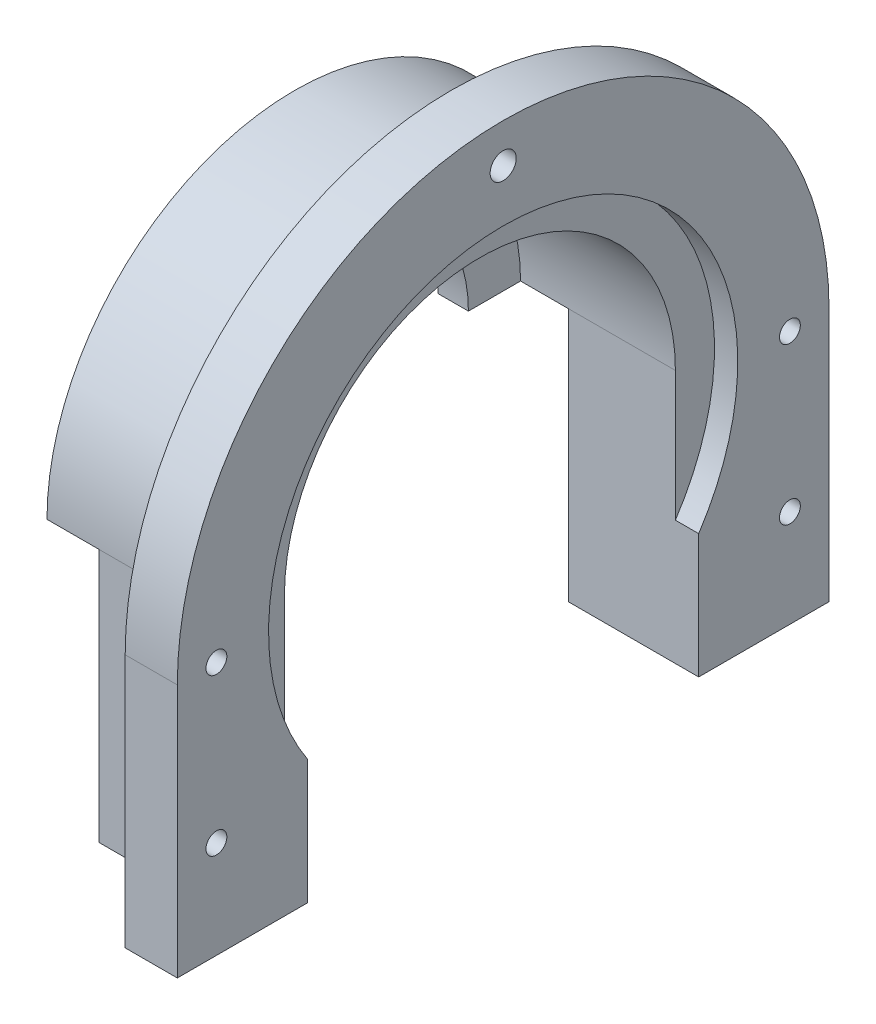
ISO-10303-21;
HEADER;
FILE_DESCRIPTION(('STEP AP214'),'2;1');
FILE_NAME('part.step','',(''),(''),'','','');
FILE_SCHEMA(('AUTOMOTIVE_DESIGN { 1 0 10303 214 1 1 1 1 }'));
ENDSEC;
DATA;
#1=APPLICATION_CONTEXT('core data for automotive mechanical design processes');
#2=APPLICATION_PROTOCOL_DEFINITION('international standard','automotive_design',2000,#1);
#3=PRODUCT_CONTEXT('',#1,'mechanical');
#4=PRODUCT('Part','Part','',(#3));
#5=PRODUCT_RELATED_PRODUCT_CATEGORY('part','',(#4));
#6=PRODUCT_DEFINITION_FORMATION('','',#4);
#7=PRODUCT_DEFINITION_CONTEXT('part definition',#1,'design');
#8=PRODUCT_DEFINITION('design','',#6,#7);
#9=PRODUCT_DEFINITION_SHAPE('','',#8);
#10=(LENGTH_UNIT() NAMED_UNIT(*) SI_UNIT(.MILLI.,.METRE.));
#11=(NAMED_UNIT(*) PLANE_ANGLE_UNIT() SI_UNIT($,.RADIAN.));
#12=(NAMED_UNIT(*) SI_UNIT($,.STERADIAN.) SOLID_ANGLE_UNIT());
#13=UNCERTAINTY_MEASURE_WITH_UNIT(LENGTH_MEASURE(1.E-05),#10,'distance_accuracy_value','');
#14=(GEOMETRIC_REPRESENTATION_CONTEXT(3) GLOBAL_UNCERTAINTY_ASSIGNED_CONTEXT((#13)) GLOBAL_UNIT_ASSIGNED_CONTEXT((#10,
#11,#12)) REPRESENTATION_CONTEXT('',''));
#15=CARTESIAN_POINT('',(0.,0.,0.));
#16=DIRECTION('',(0.,0.,1.));
#17=DIRECTION('',(1.,0.,0.));
#18=AXIS2_PLACEMENT_3D('',#15,#16,#17);
#19=CARTESIAN_POINT('',(30.,0.,0.));
#20=DIRECTION('',(-1.,0.,0.));
#21=DIRECTION('',(0.,0.,1.));
#22=AXIS2_PLACEMENT_3D('',#19,#20,#21);
#23=CYLINDRICAL_SURFACE('',#22,37.5);
#24=CARTESIAN_POINT('',(35.5344886511846,0.,0.));
#25=DIRECTION('',(1.,0.,0.));
#26=DIRECTION('',(0.,1.,0.));
#27=AXIS2_PLACEMENT_3D('',#24,#25,#26);
#28=CIRCLE('',#27,37.5);
#29=CARTESIAN_POINT('',(35.5344886511846,0.,37.5));
#30=VERTEX_POINT('',#29);
#31=CARTESIAN_POINT('',(35.5344886511846,0.,-37.5));
#32=VERTEX_POINT('',#31);
#33=EDGE_CURVE('E170',#30,#32,#28,.F.);
#34=ORIENTED_EDGE('',*,*,#33,.F.);
#35=DIRECTION('',(-1.,0.,0.));
#36=VECTOR('',#35,1.);
#37=CARTESIAN_POINT('',(30.,0.,37.5));
#38=LINE('',#37,#36);
#39=CARTESIAN_POINT('',(10.,0.,37.5));
#40=VERTEX_POINT('',#39);
#41=EDGE_CURVE('E181',#30,#40,#38,.T.);
#42=ORIENTED_EDGE('',*,*,#41,.T.);
#43=DIRECTION('',(1.,0.,0.));
#44=VECTOR('',#43,1.);
#45=CARTESIAN_POINT('',(-78.0180605050575,0.,37.5));
#46=LINE('',#45,#44);
#47=CARTESIAN_POINT('',(5.83448865118458,0.,37.5));
#48=VERTEX_POINT('',#47);
#49=EDGE_CURVE('E182',#48,#40,#46,.T.);
#50=ORIENTED_EDGE('',*,*,#49,.F.);
#51=CARTESIAN_POINT('',(5.83448865118458,0.,0.));
#52=DIRECTION('',(1.,0.,0.));
#53=DIRECTION('',(0.,1.,0.));
#54=AXIS2_PLACEMENT_3D('',#51,#52,#53);
#55=CIRCLE('',#54,37.5);
#56=CARTESIAN_POINT('',(5.83448865118458,0.,-37.5));
#57=VERTEX_POINT('',#56);
#58=EDGE_CURVE('E193',#48,#57,#55,.F.);
#59=ORIENTED_EDGE('',*,*,#58,.T.);
#60=DIRECTION('',(-1.,0.,0.));
#61=VECTOR('',#60,1.);
#62=CARTESIAN_POINT('',(30.,0.,-37.5));
#63=LINE('',#62,#61);
#64=CARTESIAN_POINT('',(15.,0.,-37.5));
#65=VERTEX_POINT('',#64);
#66=EDGE_CURVE('E309',#65,#57,#63,.T.);
#67=ORIENTED_EDGE('',*,*,#66,.F.);
#68=EDGE_CURVE('E310',#32,#65,#63,.T.);
#69=ORIENTED_EDGE('',*,*,#68,.F.);
#70=EDGE_LOOP('',(#34,#42,#50,#59,#67,#69));
#71=FACE_BOUND('',#70,.T.);
#72=ADVANCED_FACE('F36',(#71),#23,.F.);
#73=CARTESIAN_POINT('',(30.,-81.0478555971922,37.5));
#74=DIRECTION('',(0.,0.,1.));
#75=DIRECTION('',(0.,-1.,0.));
#76=AXIS2_PLACEMENT_3D('',#73,#74,#75);
#77=PLANE('',#76);
#78=DIRECTION('',(1.,0.,0.));
#79=VECTOR('',#78,1.);
#80=CARTESIAN_POINT('',(-91.7447319623941,-24.8746859276655,37.5));
#81=LINE('',#80,#79);
#82=CARTESIAN_POINT('',(40.,-24.8746859276655,37.5));
#83=VERTEX_POINT('',#82);
#84=CARTESIAN_POINT('',(35.5344886511846,-24.8746859276655,37.5));
#85=VERTEX_POINT('',#84);
#86=EDGE_CURVE('E161',#83,#85,#81,.F.);
#87=ORIENTED_EDGE('',*,*,#86,.F.);
#88=DIRECTION('',(0.,1.,0.));
#89=VECTOR('',#88,1.);
#90=CARTESIAN_POINT('',(40.,-48.6871758221943,37.5));
#91=LINE('',#90,#89);
#92=CARTESIAN_POINT('',(40.,-48.6871758221943,37.5));
#93=VERTEX_POINT('',#92);
#94=EDGE_CURVE('E239',#93,#83,#91,.T.);
#95=ORIENTED_EDGE('',*,*,#94,.F.);
#96=DIRECTION('',(1.,0.,0.));
#97=VECTOR('',#96,1.);
#98=CARTESIAN_POINT('',(30.,-48.6871758221943,37.5));
#99=LINE('',#98,#97);
#100=CARTESIAN_POINT('',(10.,-48.6871758221943,37.5));
#101=VERTEX_POINT('',#100);
#102=EDGE_CURVE('E302',#101,#93,#99,.T.);
#103=ORIENTED_EDGE('',*,*,#102,.F.);
#104=DIRECTION('',(0.,1.,0.));
#105=VECTOR('',#104,1.);
#106=CARTESIAN_POINT('',(10.,-81.0478555971922,37.5));
#107=LINE('',#106,#105);
#108=EDGE_CURVE('E293',#101,#40,#107,.T.);
#109=ORIENTED_EDGE('',*,*,#108,.T.);
#110=ORIENTED_EDGE('',*,*,#41,.F.);
#111=DIRECTION('',(0.,1.,0.));
#112=VECTOR('',#111,1.);
#113=CARTESIAN_POINT('',(35.5344886511846,-81.0478555971922,37.5));
#114=LINE('',#113,#112);
#115=EDGE_CURVE('E174',#85,#30,#114,.T.);
#116=ORIENTED_EDGE('',*,*,#115,.F.);
#117=EDGE_LOOP('',(#87,#95,#103,#109,#110,#116));
#118=FACE_BOUND('',#117,.T.);
#119=ADVANCED_FACE('F179',(#118),#77,.F.);
#120=CARTESIAN_POINT('',(30.,-81.0478555971922,-37.5));
#121=DIRECTION('',(0.,0.,-1.));
#122=DIRECTION('',(0.,1.,0.));
#123=AXIS2_PLACEMENT_3D('',#120,#121,#122);
#124=PLANE('',#123);
#125=DIRECTION('',(1.,0.,0.));
#126=VECTOR('',#125,1.);
#127=CARTESIAN_POINT('',(-91.7447319623941,-24.8746859276656,-37.5));
#128=LINE('',#127,#126);
#129=CARTESIAN_POINT('',(35.5344886511846,-24.8746859276656,-37.5));
#130=VERTEX_POINT('',#129);
#131=CARTESIAN_POINT('',(40.,-24.8746859276656,-37.5));
#132=VERTEX_POINT('',#131);
#133=EDGE_CURVE('E51',#130,#132,#128,.T.);
#134=ORIENTED_EDGE('',*,*,#133,.F.);
#135=DIRECTION('',(0.,-1.,0.));
#136=VECTOR('',#135,1.);
#137=CARTESIAN_POINT('',(35.5344886511846,-81.0478555971922,-37.5));
#138=LINE('',#137,#136);
#139=EDGE_CURVE('E12',#32,#130,#138,.T.);
#140=ORIENTED_EDGE('',*,*,#139,.F.);
#141=ORIENTED_EDGE('',*,*,#68,.T.);
#142=DIRECTION('',(0.,1.,0.));
#143=VECTOR('',#142,1.);
#144=CARTESIAN_POINT('',(15.,-81.0478555971922,-37.5));
#145=LINE('',#144,#143);
#146=CARTESIAN_POINT('',(15.,-48.6871758221943,-37.5));
#147=VERTEX_POINT('',#146);
#148=EDGE_CURVE('E274',#147,#65,#145,.T.);
#149=ORIENTED_EDGE('',*,*,#148,.F.);
#150=DIRECTION('',(-1.,0.,0.));
#151=VECTOR('',#150,1.);
#152=CARTESIAN_POINT('',(30.,-48.6871758221943,-37.5));
#153=LINE('',#152,#151);
#154=CARTESIAN_POINT('',(40.,-48.6871758221943,-37.5));
#155=VERTEX_POINT('',#154);
#156=EDGE_CURVE('E279',#155,#147,#153,.T.);
#157=ORIENTED_EDGE('',*,*,#156,.F.);
#158=DIRECTION('',(0.,-1.,0.));
#159=VECTOR('',#158,1.);
#160=CARTESIAN_POINT('',(40.,-48.6871758221943,-37.5));
#161=LINE('',#160,#159);
#162=EDGE_CURVE('E241',#132,#155,#161,.T.);
#163=ORIENTED_EDGE('',*,*,#162,.F.);
#164=EDGE_LOOP('',(#134,#140,#141,#149,#157,#163));
#165=FACE_BOUND('',#164,.T.);
#166=ADVANCED_FACE('F343',(#165),#124,.F.);
#167=CARTESIAN_POINT('',(10.,0.,0.));
#168=DIRECTION('',(-1.,0.,0.));
#169=DIRECTION('',(0.,0.,1.));
#170=AXIS2_PLACEMENT_3D('',#167,#168,#169);
#171=CYLINDRICAL_SURFACE('',#170,27.5);
#172=CARTESIAN_POINT('',(5.83448865118458,0.,0.));
#173=DIRECTION('',(1.,0.,0.));
#174=DIRECTION('',(0.,1.,0.));
#175=AXIS2_PLACEMENT_3D('',#172,#173,#174);
#176=CIRCLE('',#175,27.5);
#177=CARTESIAN_POINT('',(5.83448865118458,0.,-27.5));
#178=VERTEX_POINT('',#177);
#179=CARTESIAN_POINT('',(5.83448865118458,0.,27.5));
#180=VERTEX_POINT('',#179);
#181=EDGE_CURVE('E185',#178,#180,#176,.T.);
#182=ORIENTED_EDGE('',*,*,#181,.T.);
#183=DIRECTION('',(-1.,0.,0.));
#184=VECTOR('',#183,1.);
#185=CARTESIAN_POINT('',(10.,0.,27.5));
#186=LINE('',#185,#184);
#187=CARTESIAN_POINT('',(0.,0.,27.5));
#188=VERTEX_POINT('',#187);
#189=EDGE_CURVE('E59',#180,#188,#186,.T.);
#190=ORIENTED_EDGE('',*,*,#189,.T.);
#191=CARTESIAN_POINT('',(0.,0.,0.));
#192=DIRECTION('',(-1.,0.,0.));
#193=DIRECTION('',(0.,0.,-1.));
#194=AXIS2_PLACEMENT_3D('',#191,#192,#193);
#195=CIRCLE('',#194,27.5);
#196=CARTESIAN_POINT('',(0.,0.,-27.5));
#197=VERTEX_POINT('',#196);
#198=EDGE_CURVE('E313',#188,#197,#195,.T.);
#199=ORIENTED_EDGE('',*,*,#198,.T.);
#200=DIRECTION('',(-1.,0.,0.));
#201=VECTOR('',#200,1.);
#202=CARTESIAN_POINT('',(10.,0.,-27.5));
#203=LINE('',#202,#201);
#204=EDGE_CURVE('E44',#178,#197,#203,.T.);
#205=ORIENTED_EDGE('',*,*,#204,.F.);
#206=EDGE_LOOP('',(#182,#190,#199,#205));
#207=FACE_BOUND('',#206,.T.);
#208=ADVANCED_FACE('F38',(#207),#171,.F.);
#209=CARTESIAN_POINT('',(10.,0.,-27.5));
#210=DIRECTION('',(0.,1.,0.));
#211=DIRECTION('',(0.,0.,1.));
#212=AXIS2_PLACEMENT_3D('',#209,#210,#211);
#213=PLANE('',#212);
#214=ORIENTED_EDGE('',*,*,#66,.T.);
#215=DIRECTION('',(0.,0.,1.));
#216=VECTOR('',#215,1.);
#217=CARTESIAN_POINT('',(5.83448865118458,0.,-27.5));
#218=LINE('',#217,#216);
#219=EDGE_CURVE('E190',#57,#178,#218,.T.);
#220=ORIENTED_EDGE('',*,*,#219,.T.);
#221=ORIENTED_EDGE('',*,*,#204,.T.);
#222=DIRECTION('',(0.,0.,-1.));
#223=VECTOR('',#222,1.);
#224=CARTESIAN_POINT('',(0.,0.,-27.5));
#225=LINE('',#224,#223);
#226=CARTESIAN_POINT('',(0.,0.,-47.5));
#227=VERTEX_POINT('',#226);
#228=EDGE_CURVE('E315',#197,#227,#225,.T.);
#229=ORIENTED_EDGE('',*,*,#228,.T.);
#230=DIRECTION('',(-1.,0.,0.));
#231=VECTOR('',#230,1.);
#232=CARTESIAN_POINT('',(10.,0.,-47.5));
#233=LINE('',#232,#231);
#234=CARTESIAN_POINT('',(15.,0.,-47.5));
#235=VERTEX_POINT('',#234);
#236=EDGE_CURVE('E328',#235,#227,#233,.T.);
#237=ORIENTED_EDGE('',*,*,#236,.F.);
#238=DIRECTION('',(0.,0.,-1.));
#239=VECTOR('',#238,1.);
#240=CARTESIAN_POINT('',(15.,0.,-37.5));
#241=LINE('',#240,#239);
#242=EDGE_CURVE('E270',#65,#235,#241,.T.);
#243=ORIENTED_EDGE('',*,*,#242,.F.);
#244=EDGE_LOOP('',(#214,#220,#221,#229,#237,#243));
#245=FACE_BOUND('',#244,.T.);
#246=ADVANCED_FACE('F334',(#245),#213,.F.);
#247=CARTESIAN_POINT('',(10.,0.,47.5));
#248=DIRECTION('',(0.,1.,0.));
#249=DIRECTION('',(0.,0.,1.));
#250=AXIS2_PLACEMENT_3D('',#247,#248,#249);
#251=PLANE('',#250);
#252=DIRECTION('',(0.,0.,1.));
#253=VECTOR('',#252,1.);
#254=CARTESIAN_POINT('',(5.83448865118458,0.,37.5));
#255=LINE('',#254,#253);
#256=EDGE_CURVE('E195',#180,#48,#255,.T.);
#257=ORIENTED_EDGE('',*,*,#256,.T.);
#258=ORIENTED_EDGE('',*,*,#49,.T.);
#259=DIRECTION('',(0.,0.,-1.));
#260=VECTOR('',#259,1.);
#261=CARTESIAN_POINT('',(10.,0.,47.5));
#262=LINE('',#261,#260);
#263=CARTESIAN_POINT('',(10.,0.,47.5));
#264=VERTEX_POINT('',#263);
#265=EDGE_CURVE('E290',#264,#40,#262,.T.);
#266=ORIENTED_EDGE('',*,*,#265,.F.);
#267=DIRECTION('',(-1.,0.,0.));
#268=VECTOR('',#267,1.);
#269=CARTESIAN_POINT('',(10.,0.,47.5));
#270=LINE('',#269,#268);
#271=CARTESIAN_POINT('',(0.,0.,47.5));
#272=VERTEX_POINT('',#271);
#273=EDGE_CURVE('E324',#264,#272,#270,.T.);
#274=ORIENTED_EDGE('',*,*,#273,.T.);
#275=DIRECTION('',(0.,0.,-1.));
#276=VECTOR('',#275,1.);
#277=CARTESIAN_POINT('',(0.,0.,47.5));
#278=LINE('',#277,#276);
#279=EDGE_CURVE('E321',#272,#188,#278,.T.);
#280=ORIENTED_EDGE('',*,*,#279,.T.);
#281=ORIENTED_EDGE('',*,*,#189,.F.);
#282=EDGE_LOOP('',(#257,#258,#266,#274,#280,#281));
#283=FACE_BOUND('',#282,.T.);
#284=ADVANCED_FACE('F348',(#283),#251,.F.);
#285=CARTESIAN_POINT('',(10.,0.,0.));
#286=DIRECTION('',(-1.,0.,0.));
#287=DIRECTION('',(0.,0.,1.));
#288=AXIS2_PLACEMENT_3D('',#285,#286,#287);
#289=CYLINDRICAL_SURFACE('',#288,47.5);
#290=CARTESIAN_POINT('',(0.,0.,0.));
#291=DIRECTION('',(1.,0.,0.));
#292=DIRECTION('',(0.,0.,-1.));
#293=AXIS2_PLACEMENT_3D('',#290,#291,#292);
#294=CIRCLE('',#293,47.5);
#295=EDGE_CURVE('E318',#227,#272,#294,.T.);
#296=ORIENTED_EDGE('',*,*,#295,.T.);
#297=ORIENTED_EDGE('',*,*,#273,.F.);
#298=CARTESIAN_POINT('',(30.,0.,47.5));
#299=VERTEX_POINT('',#298);
#300=EDGE_CURVE('E325',#299,#264,#270,.T.);
#301=ORIENTED_EDGE('',*,*,#300,.F.);
#302=CARTESIAN_POINT('',(30.,0.,0.));
#303=DIRECTION('',(1.,0.,0.));
#304=DIRECTION('',(0.,0.,-1.));
#305=AXIS2_PLACEMENT_3D('',#302,#303,#304);
#306=CIRCLE('',#305,47.5);
#307=CARTESIAN_POINT('',(30.,0.,-47.5));
#308=VERTEX_POINT('',#307);
#309=EDGE_CURVE('E298',#308,#299,#306,.T.);
#310=ORIENTED_EDGE('',*,*,#309,.F.);
#311=EDGE_CURVE('E329',#308,#235,#233,.T.);
#312=ORIENTED_EDGE('',*,*,#311,.T.);
#313=ORIENTED_EDGE('',*,*,#236,.T.);
#314=EDGE_LOOP('',(#296,#297,#301,#310,#312,#313));
#315=FACE_BOUND('',#314,.T.);
#316=ADVANCED_FACE('F365',(#315),#289,.T.);
#317=CARTESIAN_POINT('',(0.,0.,0.));
#318=DIRECTION('',(1.,0.,0.));
#319=DIRECTION('',(0.,0.,-1.));
#320=AXIS2_PLACEMENT_3D('',#317,#318,#319);
#321=PLANE('',#320);
#322=ORIENTED_EDGE('',*,*,#198,.F.);
#323=ORIENTED_EDGE('',*,*,#279,.F.);
#324=ORIENTED_EDGE('',*,*,#295,.F.);
#325=ORIENTED_EDGE('',*,*,#228,.F.);
#326=EDGE_LOOP('',(#322,#323,#324,#325));
#327=FACE_BOUND('',#326,.T.);
#328=ADVANCED_FACE('F340',(#327),#321,.F.);
#329=CARTESIAN_POINT('',(30.,-81.0478555971922,47.5));
#330=DIRECTION('',(0.,0.,-1.));
#331=DIRECTION('',(0.,1.,0.));
#332=AXIS2_PLACEMENT_3D('',#329,#330,#331);
#333=PLANE('',#332);
#334=DIRECTION('',(-1.,0.,0.));
#335=VECTOR('',#334,1.);
#336=CARTESIAN_POINT('',(30.,-48.6871758221943,47.5));
#337=LINE('',#336,#335);
#338=CARTESIAN_POINT('',(30.,-48.6871758221943,47.5));
#339=VERTEX_POINT('',#338);
#340=CARTESIAN_POINT('',(10.,-48.6871758221943,47.5));
#341=VERTEX_POINT('',#340);
#342=EDGE_CURVE('E299',#339,#341,#337,.T.);
#343=ORIENTED_EDGE('',*,*,#342,.F.);
#344=DIRECTION('',(0.,1.,0.));
#345=VECTOR('',#344,1.);
#346=CARTESIAN_POINT('',(30.,-81.0478555971922,47.5));
#347=LINE('',#346,#345);
#348=EDGE_CURVE('E278',#339,#299,#347,.T.);
#349=ORIENTED_EDGE('',*,*,#348,.T.);
#350=ORIENTED_EDGE('',*,*,#300,.T.);
#351=DIRECTION('',(0.,1.,0.));
#352=VECTOR('',#351,1.);
#353=CARTESIAN_POINT('',(10.,-81.0478555971922,47.5));
#354=LINE('',#353,#352);
#355=EDGE_CURVE('E294',#341,#264,#354,.T.);
#356=ORIENTED_EDGE('',*,*,#355,.F.);
#357=EDGE_LOOP('',(#343,#349,#350,#356));
#358=FACE_BOUND('',#357,.T.);
#359=ADVANCED_FACE('F364',(#358),#333,.F.);
#360=CARTESIAN_POINT('',(10.,-81.0478555971922,47.5));
#361=DIRECTION('',(1.,0.,0.));
#362=DIRECTION('',(0.,0.,-1.));
#363=AXIS2_PLACEMENT_3D('',#360,#361,#362);
#364=PLANE('',#363);
#365=DIRECTION('',(0.,0.,-1.));
#366=VECTOR('',#365,1.);
#367=CARTESIAN_POINT('',(10.,-48.6871758221943,47.5));
#368=LINE('',#367,#366);
#369=EDGE_CURVE('E295',#341,#101,#368,.T.);
#370=ORIENTED_EDGE('',*,*,#369,.F.);
#371=ORIENTED_EDGE('',*,*,#355,.T.);
#372=ORIENTED_EDGE('',*,*,#265,.T.);
#373=ORIENTED_EDGE('',*,*,#108,.F.);
#374=EDGE_LOOP('',(#370,#371,#372,#373));
#375=FACE_BOUND('',#374,.T.);
#376=ADVANCED_FACE('F378',(#375),#364,.F.);
#377=CARTESIAN_POINT('',(0.,-48.6871758221943,0.));
#378=DIRECTION('',(0.,-1.,0.));
#379=DIRECTION('',(0.,0.,-1.));
#380=AXIS2_PLACEMENT_3D('',#377,#378,#379);
#381=PLANE('',#380);
#382=ORIENTED_EDGE('',*,*,#102,.T.);
#383=DIRECTION('',(0.,0.,-1.));
#384=VECTOR('',#383,1.);
#385=CARTESIAN_POINT('',(40.,-48.6871758221943,37.5));
#386=LINE('',#385,#384);
#387=CARTESIAN_POINT('',(40.,-48.6871758221943,62.5));
#388=VERTEX_POINT('',#387);
#389=EDGE_CURVE('E236',#388,#93,#386,.T.);
#390=ORIENTED_EDGE('',*,*,#389,.F.);
#391=DIRECTION('',(-1.,0.,0.));
#392=VECTOR('',#391,1.);
#393=CARTESIAN_POINT('',(40.,-48.6871758221943,62.5));
#394=LINE('',#393,#392);
#395=CARTESIAN_POINT('',(30.,-48.6871758221943,62.5));
#396=VERTEX_POINT('',#395);
#397=EDGE_CURVE('E263',#388,#396,#394,.T.);
#398=ORIENTED_EDGE('',*,*,#397,.T.);
#399=DIRECTION('',(0.,0.,-1.));
#400=VECTOR('',#399,1.);
#401=CARTESIAN_POINT('',(30.,-48.6871758221943,37.5));
#402=LINE('',#401,#400);
#403=EDGE_CURVE('E252',#396,#339,#402,.T.);
#404=ORIENTED_EDGE('',*,*,#403,.T.);
#405=ORIENTED_EDGE('',*,*,#342,.T.);
#406=ORIENTED_EDGE('',*,*,#369,.T.);
#407=EDGE_LOOP('',(#382,#390,#398,#404,#405,#406));
#408=FACE_BOUND('',#407,.T.);
#409=ADVANCED_FACE('F360',(#408),#381,.T.);
#410=CARTESIAN_POINT('',(15.,-81.0478555971922,-37.5));
#411=DIRECTION('',(1.,0.,0.));
#412=DIRECTION('',(0.,0.,-1.));
#413=AXIS2_PLACEMENT_3D('',#410,#411,#412);
#414=PLANE('',#413);
#415=DIRECTION('',(0.,0.,-1.));
#416=VECTOR('',#415,1.);
#417=CARTESIAN_POINT('',(15.,-48.6871758221943,-37.5));
#418=LINE('',#417,#416);
#419=CARTESIAN_POINT('',(15.,-48.6871758221943,-47.5));
#420=VERTEX_POINT('',#419);
#421=EDGE_CURVE('E275',#147,#420,#418,.T.);
#422=ORIENTED_EDGE('',*,*,#421,.F.);
#423=ORIENTED_EDGE('',*,*,#148,.T.);
#424=ORIENTED_EDGE('',*,*,#242,.T.);
#425=DIRECTION('',(0.,1.,0.));
#426=VECTOR('',#425,1.);
#427=CARTESIAN_POINT('',(15.,-81.0478555971922,-47.5));
#428=LINE('',#427,#426);
#429=EDGE_CURVE('E273',#420,#235,#428,.T.);
#430=ORIENTED_EDGE('',*,*,#429,.F.);
#431=EDGE_LOOP('',(#422,#423,#424,#430));
#432=FACE_BOUND('',#431,.T.);
#433=ADVANCED_FACE('F400',(#432),#414,.F.);
#434=CARTESIAN_POINT('',(30.,-81.0478555971922,-47.5));
#435=DIRECTION('',(0.,0.,1.));
#436=DIRECTION('',(0.,-1.,0.));
#437=AXIS2_PLACEMENT_3D('',#434,#435,#436);
#438=PLANE('',#437);
#439=DIRECTION('',(1.,0.,0.));
#440=VECTOR('',#439,1.);
#441=CARTESIAN_POINT('',(30.,-48.6871758221943,-47.5));
#442=LINE('',#441,#440);
#443=CARTESIAN_POINT('',(30.,-48.6871758221943,-47.5));
#444=VERTEX_POINT('',#443);
#445=EDGE_CURVE('E282',#420,#444,#442,.T.);
#446=ORIENTED_EDGE('',*,*,#445,.F.);
#447=ORIENTED_EDGE('',*,*,#429,.T.);
#448=ORIENTED_EDGE('',*,*,#311,.F.);
#449=DIRECTION('',(0.,1.,0.));
#450=VECTOR('',#449,1.);
#451=CARTESIAN_POINT('',(30.,-81.0478555971922,-47.5));
#452=LINE('',#451,#450);
#453=EDGE_CURVE('E269',#444,#308,#452,.T.);
#454=ORIENTED_EDGE('',*,*,#453,.F.);
#455=EDGE_LOOP('',(#446,#447,#448,#454));
#456=FACE_BOUND('',#455,.T.);
#457=ADVANCED_FACE('F392',(#456),#438,.F.);
#458=CARTESIAN_POINT('',(0.,-48.6871758221943,0.));
#459=DIRECTION('',(0.,-1.,0.));
#460=DIRECTION('',(0.,0.,-1.));
#461=AXIS2_PLACEMENT_3D('',#458,#459,#460);
#462=PLANE('',#461);
#463=ORIENTED_EDGE('',*,*,#445,.T.);
#464=DIRECTION('',(0.,0.,-1.));
#465=VECTOR('',#464,1.);
#466=CARTESIAN_POINT('',(30.,-48.6871758221943,-62.5));
#467=LINE('',#466,#465);
#468=CARTESIAN_POINT('',(30.,-48.6871758221943,-62.5));
#469=VERTEX_POINT('',#468);
#470=EDGE_CURVE('E255',#444,#469,#467,.T.);
#471=ORIENTED_EDGE('',*,*,#470,.T.);
#472=DIRECTION('',(-1.,0.,0.));
#473=VECTOR('',#472,1.);
#474=CARTESIAN_POINT('',(40.,-48.6871758221943,-62.5));
#475=LINE('',#474,#473);
#476=CARTESIAN_POINT('',(40.,-48.6871758221943,-62.5));
#477=VERTEX_POINT('',#476);
#478=EDGE_CURVE('E260',#477,#469,#475,.T.);
#479=ORIENTED_EDGE('',*,*,#478,.F.);
#480=DIRECTION('',(0.,0.,-1.));
#481=VECTOR('',#480,1.);
#482=CARTESIAN_POINT('',(40.,-48.6871758221943,-62.5));
#483=LINE('',#482,#481);
#484=EDGE_CURVE('E243',#155,#477,#483,.T.);
#485=ORIENTED_EDGE('',*,*,#484,.F.);
#486=ORIENTED_EDGE('',*,*,#156,.T.);
#487=ORIENTED_EDGE('',*,*,#421,.T.);
#488=EDGE_LOOP('',(#463,#471,#479,#485,#486,#487));
#489=FACE_BOUND('',#488,.T.);
#490=ADVANCED_FACE('F394',(#489),#462,.T.);
#491=CARTESIAN_POINT('',(40.,0.,0.));
#492=DIRECTION('',(1.,0.,0.));
#493=DIRECTION('',(0.,0.,-1.));
#494=AXIS2_PLACEMENT_3D('',#491,#492,#493);
#495=PLANE('',#494);
#496=CARTESIAN_POINT('',(40.,-30.,-55.));
#497=DIRECTION('',(1.,0.,0.));
#498=DIRECTION('',(0.,0.,1.));
#499=AXIS2_PLACEMENT_3D('',#496,#497,#498);
#500=CIRCLE('',#499,2.);
#501=CARTESIAN_POINT('',(40.,-30.,-53.));
#502=VERTEX_POINT('',#501);
#503=EDGE_CURVE('E206',#502,#502,#500,.T.);
#504=ORIENTED_EDGE('',*,*,#503,.F.);
#505=EDGE_LOOP('',(#504));
#506=FACE_BOUND('',#505,.T.);
#507=CARTESIAN_POINT('',(40.,0.,55.));
#508=DIRECTION('',(1.,0.,0.));
#509=DIRECTION('',(0.,0.,-1.));
#510=AXIS2_PLACEMENT_3D('',#507,#508,#509);
#511=CIRCLE('',#510,2.);
#512=CARTESIAN_POINT('',(40.,0.,53.));
#513=VERTEX_POINT('',#512);
#514=EDGE_CURVE('E218',#513,#513,#511,.T.);
#515=ORIENTED_EDGE('',*,*,#514,.F.);
#516=EDGE_LOOP('',(#515));
#517=FACE_BOUND('',#516,.T.);
#518=ORIENTED_EDGE('',*,*,#94,.T.);
#519=CARTESIAN_POINT('',(40.,0.,0.));
#520=DIRECTION('',(-1.,0.,0.));
#521=DIRECTION('',(0.,-1.,0.));
#522=AXIS2_PLACEMENT_3D('',#519,#520,#521);
#523=CIRCLE('',#522,45.);
#524=EDGE_CURVE('E165',#83,#132,#523,.T.);
#525=ORIENTED_EDGE('',*,*,#524,.T.);
#526=ORIENTED_EDGE('',*,*,#162,.T.);
#527=ORIENTED_EDGE('',*,*,#484,.T.);
#528=DIRECTION('',(0.,1.,0.));
#529=VECTOR('',#528,1.);
#530=CARTESIAN_POINT('',(40.,-48.6871758221943,-62.5));
#531=LINE('',#530,#529);
#532=CARTESIAN_POINT('',(40.,0.,-62.5));
#533=VERTEX_POINT('',#532);
#534=EDGE_CURVE('E245',#477,#533,#531,.T.);
#535=ORIENTED_EDGE('',*,*,#534,.T.);
#536=CARTESIAN_POINT('',(40.,0.,0.));
#537=DIRECTION('',(1.,0.,0.));
#538=DIRECTION('',(0.,0.,-1.));
#539=AXIS2_PLACEMENT_3D('',#536,#537,#538);
#540=CIRCLE('',#539,62.5);
#541=CARTESIAN_POINT('',(40.,0.,62.5));
#542=VERTEX_POINT('',#541);
#543=EDGE_CURVE('E230',#533,#542,#540,.T.);
#544=ORIENTED_EDGE('',*,*,#543,.T.);
#545=DIRECTION('',(0.,-1.,0.));
#546=VECTOR('',#545,1.);
#547=CARTESIAN_POINT('',(40.,0.,62.5));
#548=LINE('',#547,#546);
#549=EDGE_CURVE('E233',#542,#388,#548,.T.);
#550=ORIENTED_EDGE('',*,*,#549,.T.);
#551=ORIENTED_EDGE('',*,*,#389,.T.);
#552=EDGE_LOOP('',(#518,#525,#526,#527,#535,#544,#550,#551));
#553=FACE_BOUND('',#552,.T.);
#554=CARTESIAN_POINT('',(40.,-30.,55.));
#555=DIRECTION('',(1.,0.,0.));
#556=DIRECTION('',(0.,0.,-1.));
#557=AXIS2_PLACEMENT_3D('',#554,#555,#556);
#558=CIRCLE('',#557,2.);
#559=CARTESIAN_POINT('',(40.,-30.,53.));
#560=VERTEX_POINT('',#559);
#561=EDGE_CURVE('E224',#560,#560,#558,.T.);
#562=ORIENTED_EDGE('',*,*,#561,.F.);
#563=EDGE_LOOP('',(#562));
#564=FACE_BOUND('',#563,.T.);
#565=CARTESIAN_POINT('',(40.,55.,0.));
#566=DIRECTION('',(1.,0.,0.));
#567=DIRECTION('',(0.,0.,-1.));
#568=AXIS2_PLACEMENT_3D('',#565,#566,#567);
#569=CIRCLE('',#568,2.5);
#570=CARTESIAN_POINT('',(40.,55.,-2.5));
#571=VERTEX_POINT('',#570);
#572=EDGE_CURVE('E212',#571,#571,#569,.T.);
#573=ORIENTED_EDGE('',*,*,#572,.F.);
#574=EDGE_LOOP('',(#573));
#575=FACE_BOUND('',#574,.T.);
#576=CARTESIAN_POINT('',(40.,0.,-55.));
#577=DIRECTION('',(1.,0.,0.));
#578=DIRECTION('',(0.,0.,1.));
#579=AXIS2_PLACEMENT_3D('',#576,#577,#578);
#580=CIRCLE('',#579,2.);
#581=CARTESIAN_POINT('',(40.,0.,-53.));
#582=VERTEX_POINT('',#581);
#583=EDGE_CURVE('E200',#582,#582,#580,.T.);
#584=ORIENTED_EDGE('',*,*,#583,.F.);
#585=EDGE_LOOP('',(#584));
#586=FACE_BOUND('',#585,.T.);
#587=ADVANCED_FACE('F436',(#506,#517,#553,#564,#575,#586),#495,.T.);
#588=CARTESIAN_POINT('',(30.,0.,0.));
#589=DIRECTION('',(1.,0.,0.));
#590=DIRECTION('',(0.,0.,-1.));
#591=AXIS2_PLACEMENT_3D('',#588,#589,#590);
#592=PLANE('',#591);
#593=ORIENTED_EDGE('',*,*,#348,.F.);
#594=ORIENTED_EDGE('',*,*,#403,.F.);
#595=DIRECTION('',(0.,-1.,0.));
#596=VECTOR('',#595,1.);
#597=CARTESIAN_POINT('',(30.,0.,62.5));
#598=LINE('',#597,#596);
#599=CARTESIAN_POINT('',(30.,0.,62.5));
#600=VERTEX_POINT('',#599);
#601=EDGE_CURVE('E250',#600,#396,#598,.T.);
#602=ORIENTED_EDGE('',*,*,#601,.F.);
#603=CARTESIAN_POINT('',(30.,0.,0.));
#604=DIRECTION('',(1.,0.,0.));
#605=DIRECTION('',(0.,0.,-1.));
#606=AXIS2_PLACEMENT_3D('',#603,#604,#605);
#607=CIRCLE('',#606,62.5);
#608=CARTESIAN_POINT('',(30.,0.,-62.5));
#609=VERTEX_POINT('',#608);
#610=EDGE_CURVE('E227',#609,#600,#607,.T.);
#611=ORIENTED_EDGE('',*,*,#610,.F.);
#612=DIRECTION('',(0.,1.,0.));
#613=VECTOR('',#612,1.);
#614=CARTESIAN_POINT('',(30.,-48.6871758221943,-62.5));
#615=LINE('',#614,#613);
#616=EDGE_CURVE('E234',#469,#609,#615,.T.);
#617=ORIENTED_EDGE('',*,*,#616,.F.);
#618=ORIENTED_EDGE('',*,*,#470,.F.);
#619=ORIENTED_EDGE('',*,*,#453,.T.);
#620=ORIENTED_EDGE('',*,*,#309,.T.);
#621=EDGE_LOOP('',(#593,#594,#602,#611,#617,#618,#619,#620));
#622=FACE_BOUND('',#621,.T.);
#623=CARTESIAN_POINT('',(30.,-30.,55.));
#624=DIRECTION('',(1.,0.,0.));
#625=DIRECTION('',(0.,0.,-1.));
#626=AXIS2_PLACEMENT_3D('',#623,#624,#625);
#627=CIRCLE('',#626,2.);
#628=CARTESIAN_POINT('',(30.,-30.,53.));
#629=VERTEX_POINT('',#628);
#630=EDGE_CURVE('E221',#629,#629,#627,.T.);
#631=ORIENTED_EDGE('',*,*,#630,.T.);
#632=EDGE_LOOP('',(#631));
#633=FACE_BOUND('',#632,.T.);
#634=CARTESIAN_POINT('',(30.,0.,55.));
#635=DIRECTION('',(1.,0.,0.));
#636=DIRECTION('',(0.,0.,-1.));
#637=AXIS2_PLACEMENT_3D('',#634,#635,#636);
#638=CIRCLE('',#637,2.);
#639=CARTESIAN_POINT('',(30.,0.,53.));
#640=VERTEX_POINT('',#639);
#641=EDGE_CURVE('E215',#640,#640,#638,.T.);
#642=ORIENTED_EDGE('',*,*,#641,.T.);
#643=EDGE_LOOP('',(#642));
#644=FACE_BOUND('',#643,.T.);
#645=CARTESIAN_POINT('',(30.,55.,0.));
#646=DIRECTION('',(1.,0.,0.));
#647=DIRECTION('',(0.,0.,-1.));
#648=AXIS2_PLACEMENT_3D('',#645,#646,#647);
#649=CIRCLE('',#648,2.5);
#650=CARTESIAN_POINT('',(30.,55.,-2.5));
#651=VERTEX_POINT('',#650);
#652=EDGE_CURVE('E209',#651,#651,#649,.T.);
#653=ORIENTED_EDGE('',*,*,#652,.T.);
#654=EDGE_LOOP('',(#653));
#655=FACE_BOUND('',#654,.T.);
#656=CARTESIAN_POINT('',(30.,-30.,-55.));
#657=DIRECTION('',(1.,0.,0.));
#658=DIRECTION('',(0.,0.,1.));
#659=AXIS2_PLACEMENT_3D('',#656,#657,#658);
#660=CIRCLE('',#659,2.);
#661=CARTESIAN_POINT('',(30.,-30.,-53.));
#662=VERTEX_POINT('',#661);
#663=EDGE_CURVE('E203',#662,#662,#660,.T.);
#664=ORIENTED_EDGE('',*,*,#663,.T.);
#665=EDGE_LOOP('',(#664));
#666=FACE_BOUND('',#665,.T.);
#667=CARTESIAN_POINT('',(30.,0.,-55.));
#668=DIRECTION('',(1.,0.,0.));
#669=DIRECTION('',(0.,0.,1.));
#670=AXIS2_PLACEMENT_3D('',#667,#668,#669);
#671=CIRCLE('',#670,2.);
#672=CARTESIAN_POINT('',(30.,0.,-53.));
#673=VERTEX_POINT('',#672);
#674=EDGE_CURVE('E199',#673,#673,#671,.T.);
#675=ORIENTED_EDGE('',*,*,#674,.T.);
#676=EDGE_LOOP('',(#675));
#677=FACE_BOUND('',#676,.T.);
#678=ADVANCED_FACE('F385',(#622,#633,#644,#655,#666,#677),#592,.F.);
#679=CARTESIAN_POINT('',(40.,0.,0.));
#680=DIRECTION('',(-1.,0.,0.));
#681=DIRECTION('',(0.,0.,1.));
#682=AXIS2_PLACEMENT_3D('',#679,#680,#681);
#683=CYLINDRICAL_SURFACE('',#682,62.5);
#684=ORIENTED_EDGE('',*,*,#610,.T.);
#685=DIRECTION('',(-1.,0.,0.));
#686=VECTOR('',#685,1.);
#687=CARTESIAN_POINT('',(40.,0.,62.5));
#688=LINE('',#687,#686);
#689=EDGE_CURVE('E266',#542,#600,#688,.T.);
#690=ORIENTED_EDGE('',*,*,#689,.F.);
#691=ORIENTED_EDGE('',*,*,#543,.F.);
#692=DIRECTION('',(-1.,0.,0.));
#693=VECTOR('',#692,1.);
#694=CARTESIAN_POINT('',(40.,0.,-62.5));
#695=LINE('',#694,#693);
#696=EDGE_CURVE('E247',#533,#609,#695,.T.);
#697=ORIENTED_EDGE('',*,*,#696,.T.);
#698=EDGE_LOOP('',(#684,#690,#691,#697));
#699=FACE_BOUND('',#698,.T.);
#700=ADVANCED_FACE('F442',(#699),#683,.T.);
#701=CARTESIAN_POINT('',(40.,0.,62.5));
#702=DIRECTION('',(0.,0.,-1.));
#703=DIRECTION('',(0.,1.,0.));
#704=AXIS2_PLACEMENT_3D('',#701,#702,#703);
#705=PLANE('',#704);
#706=ORIENTED_EDGE('',*,*,#601,.T.);
#707=ORIENTED_EDGE('',*,*,#397,.F.);
#708=ORIENTED_EDGE('',*,*,#549,.F.);
#709=ORIENTED_EDGE('',*,*,#689,.T.);
#710=EDGE_LOOP('',(#706,#707,#708,#709));
#711=FACE_BOUND('',#710,.T.);
#712=ADVANCED_FACE('F445',(#711),#705,.F.);
#713=CARTESIAN_POINT('',(40.,-48.6871758221943,-62.5));
#714=DIRECTION('',(0.,0.,1.));
#715=DIRECTION('',(0.,-1.,0.));
#716=AXIS2_PLACEMENT_3D('',#713,#714,#715);
#717=PLANE('',#716);
#718=ORIENTED_EDGE('',*,*,#616,.T.);
#719=ORIENTED_EDGE('',*,*,#696,.F.);
#720=ORIENTED_EDGE('',*,*,#534,.F.);
#721=ORIENTED_EDGE('',*,*,#478,.T.);
#722=EDGE_LOOP('',(#718,#719,#720,#721));
#723=FACE_BOUND('',#722,.T.);
#724=ADVANCED_FACE('F434',(#723),#717,.F.);
#725=CARTESIAN_POINT('',(40.,-30.,55.));
#726=DIRECTION('',(-1.,0.,0.));
#727=DIRECTION('',(0.,0.,1.));
#728=AXIS2_PLACEMENT_3D('',#725,#726,#727);
#729=CYLINDRICAL_SURFACE('',#728,2.);
#730=ORIENTED_EDGE('',*,*,#561,.T.);
#731=EDGE_LOOP('',(#730));
#732=FACE_BOUND('',#731,.T.);
#733=ORIENTED_EDGE('',*,*,#630,.F.);
#734=EDGE_LOOP('',(#733));
#735=FACE_BOUND('',#734,.T.);
#736=ADVANCED_FACE('F430',(#732,#735),#729,.F.);
#737=CARTESIAN_POINT('',(40.,0.,55.));
#738=DIRECTION('',(-1.,0.,0.));
#739=DIRECTION('',(0.,0.,1.));
#740=AXIS2_PLACEMENT_3D('',#737,#738,#739);
#741=CYLINDRICAL_SURFACE('',#740,2.);
#742=ORIENTED_EDGE('',*,*,#514,.T.);
#743=EDGE_LOOP('',(#742));
#744=FACE_BOUND('',#743,.T.);
#745=ORIENTED_EDGE('',*,*,#641,.F.);
#746=EDGE_LOOP('',(#745));
#747=FACE_BOUND('',#746,.T.);
#748=ADVANCED_FACE('F426',(#744,#747),#741,.F.);
#749=CARTESIAN_POINT('',(40.,55.,0.));
#750=DIRECTION('',(-1.,0.,0.));
#751=DIRECTION('',(0.,0.,1.));
#752=AXIS2_PLACEMENT_3D('',#749,#750,#751);
#753=CYLINDRICAL_SURFACE('',#752,2.5);
#754=ORIENTED_EDGE('',*,*,#572,.T.);
#755=EDGE_LOOP('',(#754));
#756=FACE_BOUND('',#755,.T.);
#757=ORIENTED_EDGE('',*,*,#652,.F.);
#758=EDGE_LOOP('',(#757));
#759=FACE_BOUND('',#758,.T.);
#760=ADVANCED_FACE('F422',(#756,#759),#753,.F.);
#761=CARTESIAN_POINT('',(40.,-30.,-55.));
#762=DIRECTION('',(-1.,0.,0.));
#763=DIRECTION('',(0.,0.,1.));
#764=AXIS2_PLACEMENT_3D('',#761,#762,#763);
#765=CYLINDRICAL_SURFACE('',#764,2.);
#766=ORIENTED_EDGE('',*,*,#503,.T.);
#767=EDGE_LOOP('',(#766));
#768=FACE_BOUND('',#767,.T.);
#769=ORIENTED_EDGE('',*,*,#663,.F.);
#770=EDGE_LOOP('',(#769));
#771=FACE_BOUND('',#770,.T.);
#772=ADVANCED_FACE('F415',(#768,#771),#765,.F.);
#773=CARTESIAN_POINT('',(40.,0.,-55.));
#774=DIRECTION('',(-1.,0.,0.));
#775=DIRECTION('',(0.,0.,1.));
#776=AXIS2_PLACEMENT_3D('',#773,#774,#775);
#777=CYLINDRICAL_SURFACE('',#776,2.);
#778=ORIENTED_EDGE('',*,*,#583,.T.);
#779=EDGE_LOOP('',(#778));
#780=FACE_BOUND('',#779,.T.);
#781=ORIENTED_EDGE('',*,*,#674,.F.);
#782=EDGE_LOOP('',(#781));
#783=FACE_BOUND('',#782,.T.);
#784=ADVANCED_FACE('F408',(#780,#783),#777,.F.);
#785=CARTESIAN_POINT('',(5.83448865118457,0.,0.));
#786=DIRECTION('',(1.,0.,0.));
#787=DIRECTION('',(0.,-0.0359549586402446,-0.999353411436204));
#788=AXIS2_PLACEMENT_3D('',#785,#786,#787);
#789=PLANE('',#788);
#790=ORIENTED_EDGE('',*,*,#58,.F.);
#791=ORIENTED_EDGE('',*,*,#256,.F.);
#792=ORIENTED_EDGE('',*,*,#181,.F.);
#793=ORIENTED_EDGE('',*,*,#219,.F.);
#794=EDGE_LOOP('',(#790,#791,#792,#793));
#795=FACE_BOUND('',#794,.T.);
#796=ADVANCED_FACE('F406',(#795),#789,.T.);
#797=CARTESIAN_POINT('',(35.5344886511846,0.,0.));
#798=DIRECTION('',(1.,0.,0.));
#799=DIRECTION('',(0.,-1.,0.));
#800=AXIS2_PLACEMENT_3D('',#797,#798,#799);
#801=PLANE('',#800);
#802=ORIENTED_EDGE('',*,*,#115,.T.);
#803=ORIENTED_EDGE('',*,*,#33,.T.);
#804=ORIENTED_EDGE('',*,*,#139,.T.);
#805=CARTESIAN_POINT('',(35.5344886511846,0.,0.));
#806=DIRECTION('',(1.,0.,0.));
#807=DIRECTION('',(0.,1.,0.));
#808=AXIS2_PLACEMENT_3D('',#805,#806,#807);
#809=CIRCLE('',#808,45.);
#810=EDGE_CURVE('E164',#130,#85,#809,.T.);
#811=ORIENTED_EDGE('',*,*,#810,.T.);
#812=EDGE_LOOP('',(#802,#803,#804,#811));
#813=FACE_BOUND('',#812,.T.);
#814=ADVANCED_FACE('F173',(#813),#801,.T.);
#815=CARTESIAN_POINT('',(-91.7447319623941,0.,0.));
#816=DIRECTION('',(1.,0.,0.));
#817=DIRECTION('',(0.,1.,0.));
#818=AXIS2_PLACEMENT_3D('',#815,#816,#817);
#819=CYLINDRICAL_SURFACE('',#818,45.);
#820=ORIENTED_EDGE('',*,*,#86,.T.);
#821=ORIENTED_EDGE('',*,*,#810,.F.);
#822=ORIENTED_EDGE('',*,*,#133,.T.);
#823=ORIENTED_EDGE('',*,*,#524,.F.);
#824=EDGE_LOOP('',(#820,#821,#822,#823));
#825=FACE_BOUND('',#824,.T.);
#826=ADVANCED_FACE('F163',(#825),#819,.F.);
#827=CLOSED_SHELL('',(#72,#119,#166,#208,#246,#284,#316,#328,#359,#376,#409,#433,#457,#490,#587,
#678,#700,#712,#724,#736,#748,#760,#772,#784,#796,#814,#826));
#828=MANIFOLD_SOLID_BREP('B2',#827);
#829=ADVANCED_BREP_SHAPE_REPRESENTATION('',(#18,#828),#14);
#830=SHAPE_DEFINITION_REPRESENTATION(#9,#829);
ENDSEC;
END-ISO-10303-21;
